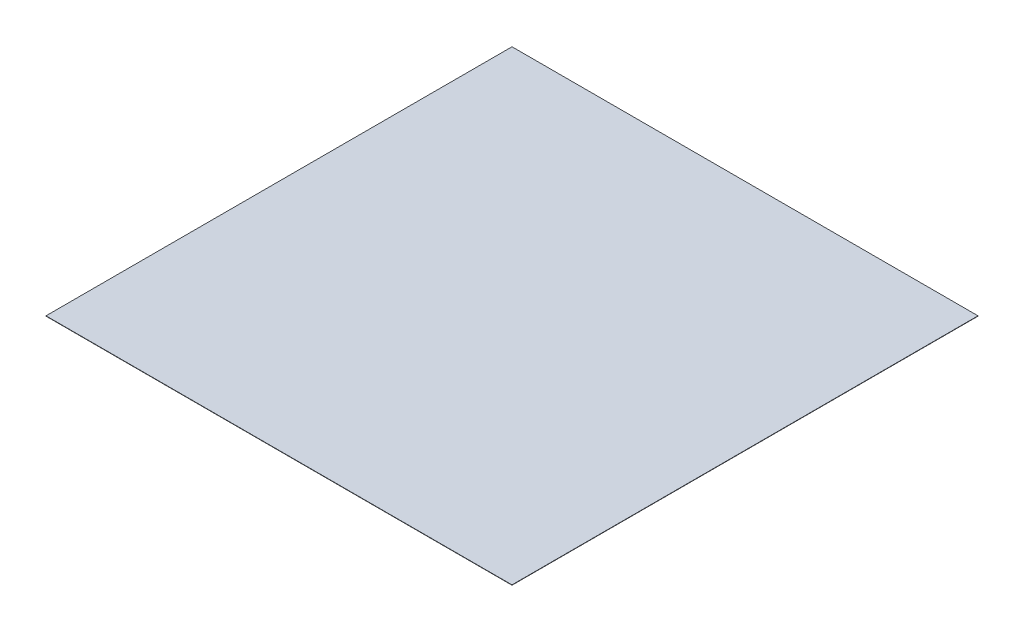
ISO-10303-21;
HEADER;
FILE_DESCRIPTION(('STEP AP214'),'2;1');
FILE_NAME('part.step','',(''),(''),'','','');
FILE_SCHEMA(('AUTOMOTIVE_DESIGN { 1 0 10303 214 1 1 1 1 }'));
ENDSEC;
DATA;
#1=APPLICATION_CONTEXT('core data for automotive mechanical design processes');
#2=APPLICATION_PROTOCOL_DEFINITION('international standard','automotive_design',2000,#1);
#3=PRODUCT_CONTEXT('',#1,'mechanical');
#4=PRODUCT('Part','Part','',(#3));
#5=PRODUCT_RELATED_PRODUCT_CATEGORY('part','',(#4));
#6=PRODUCT_DEFINITION_FORMATION('','',#4);
#7=PRODUCT_DEFINITION_CONTEXT('part definition',#1,'design');
#8=PRODUCT_DEFINITION('design','',#6,#7);
#9=PRODUCT_DEFINITION_SHAPE('','',#8);
#10=(LENGTH_UNIT() NAMED_UNIT(*) SI_UNIT(.MILLI.,.METRE.));
#11=(NAMED_UNIT(*) PLANE_ANGLE_UNIT() SI_UNIT($,.RADIAN.));
#12=(NAMED_UNIT(*) SI_UNIT($,.STERADIAN.) SOLID_ANGLE_UNIT());
#13=UNCERTAINTY_MEASURE_WITH_UNIT(LENGTH_MEASURE(1.E-05),#10,'distance_accuracy_value','');
#14=(GEOMETRIC_REPRESENTATION_CONTEXT(3) GLOBAL_UNCERTAINTY_ASSIGNED_CONTEXT((#13)) GLOBAL_UNIT_ASSIGNED_CONTEXT((#10,
#11,#12)) REPRESENTATION_CONTEXT('',''));
#15=CARTESIAN_POINT('',(0.,0.,0.));
#16=DIRECTION('',(0.,0.,1.));
#17=DIRECTION('',(1.,0.,0.));
#18=AXIS2_PLACEMENT_3D('',#15,#16,#17);
#19=CARTESIAN_POINT('',(0.,10.,0.));
#20=DIRECTION('',(1.,0.,0.));
#21=DIRECTION('',(0.,0.,-1.));
#22=AXIS2_PLACEMENT_3D('',#19,#20,#21);
#23=PLANE('',#22);
#24=DIRECTION('',(0.,0.,1.));
#25=VECTOR('',#24,1.);
#26=CARTESIAN_POINT('',(0.,0.,0.));
#27=LINE('',#26,#25);
#28=CARTESIAN_POINT('',(0.,0.,-14000.));
#29=VERTEX_POINT('',#28);
#30=CARTESIAN_POINT('',(0.,0.,0.));
#31=VERTEX_POINT('',#30);
#32=EDGE_CURVE('E96',#29,#31,#27,.T.);
#33=ORIENTED_EDGE('',*,*,#32,.T.);
#34=DIRECTION('',(0.,-1.,0.));
#35=VECTOR('',#34,1.);
#36=CARTESIAN_POINT('',(0.,10.,0.));
#37=LINE('',#36,#35);
#38=CARTESIAN_POINT('',(0.,10.,0.));
#39=VERTEX_POINT('',#38);
#40=EDGE_CURVE('E11',#39,#31,#37,.T.);
#41=ORIENTED_EDGE('',*,*,#40,.F.);
#42=DIRECTION('',(0.,0.,1.));
#43=VECTOR('',#42,1.);
#44=CARTESIAN_POINT('',(0.,10.,0.));
#45=LINE('',#44,#43);
#46=CARTESIAN_POINT('',(0.,10.,-14000.));
#47=VERTEX_POINT('',#46);
#48=EDGE_CURVE('E84',#47,#39,#45,.T.);
#49=ORIENTED_EDGE('',*,*,#48,.F.);
#50=DIRECTION('',(0.,-1.,0.));
#51=VECTOR('',#50,1.);
#52=CARTESIAN_POINT('',(0.,10.,-14000.));
#53=LINE('',#52,#51);
#54=EDGE_CURVE('E92',#47,#29,#53,.T.);
#55=ORIENTED_EDGE('',*,*,#54,.T.);
#56=EDGE_LOOP('',(#33,#41,#49,#55));
#57=FACE_BOUND('',#56,.T.);
#58=ADVANCED_FACE('F33',(#57),#23,.F.);
#59=CARTESIAN_POINT('',(0.,10.,0.));
#60=DIRECTION('',(0.,0.,-1.));
#61=DIRECTION('',(-1.,0.,0.));
#62=AXIS2_PLACEMENT_3D('',#59,#60,#61);
#63=PLANE('',#62);
#64=DIRECTION('',(1.,0.,0.));
#65=VECTOR('',#64,1.);
#66=CARTESIAN_POINT('',(0.,0.,0.));
#67=LINE('',#66,#65);
#68=CARTESIAN_POINT('',(14000.,0.,0.));
#69=VERTEX_POINT('',#68);
#70=EDGE_CURVE('E88',#31,#69,#67,.T.);
#71=ORIENTED_EDGE('',*,*,#70,.T.);
#72=DIRECTION('',(0.,-1.,0.));
#73=VECTOR('',#72,1.);
#74=CARTESIAN_POINT('',(14000.,10.,0.));
#75=LINE('',#74,#73);
#76=CARTESIAN_POINT('',(14000.,10.,0.));
#77=VERTEX_POINT('',#76);
#78=EDGE_CURVE('E41',#77,#69,#75,.T.);
#79=ORIENTED_EDGE('',*,*,#78,.F.);
#80=DIRECTION('',(1.,0.,0.));
#81=VECTOR('',#80,1.);
#82=CARTESIAN_POINT('',(0.,10.,0.));
#83=LINE('',#82,#81);
#84=EDGE_CURVE('E79',#39,#77,#83,.T.);
#85=ORIENTED_EDGE('',*,*,#84,.F.);
#86=ORIENTED_EDGE('',*,*,#40,.T.);
#87=EDGE_LOOP('',(#71,#79,#85,#86));
#88=FACE_BOUND('',#87,.T.);
#89=ADVANCED_FACE('F87',(#88),#63,.F.);
#90=CARTESIAN_POINT('',(14000.,10.,0.));
#91=DIRECTION('',(-1.,0.,0.));
#92=DIRECTION('',(0.,0.,1.));
#93=AXIS2_PLACEMENT_3D('',#90,#91,#92);
#94=PLANE('',#93);
#95=DIRECTION('',(0.,0.,-1.));
#96=VECTOR('',#95,1.);
#97=CARTESIAN_POINT('',(14000.,0.,0.));
#98=LINE('',#97,#96);
#99=CARTESIAN_POINT('',(14000.,0.,-14000.));
#100=VERTEX_POINT('',#99);
#101=EDGE_CURVE('E66',#69,#100,#98,.T.);
#102=ORIENTED_EDGE('',*,*,#101,.T.);
#103=DIRECTION('',(0.,-1.,0.));
#104=VECTOR('',#103,1.);
#105=CARTESIAN_POINT('',(14000.,10.,-14000.));
#106=LINE('',#105,#104);
#107=CARTESIAN_POINT('',(14000.,10.,-14000.));
#108=VERTEX_POINT('',#107);
#109=EDGE_CURVE('E89',#108,#100,#106,.T.);
#110=ORIENTED_EDGE('',*,*,#109,.F.);
#111=DIRECTION('',(0.,0.,-1.));
#112=VECTOR('',#111,1.);
#113=CARTESIAN_POINT('',(14000.,10.,0.));
#114=LINE('',#113,#112);
#115=EDGE_CURVE('E82',#77,#108,#114,.T.);
#116=ORIENTED_EDGE('',*,*,#115,.F.);
#117=ORIENTED_EDGE('',*,*,#78,.T.);
#118=EDGE_LOOP('',(#102,#110,#116,#117));
#119=FACE_BOUND('',#118,.T.);
#120=ADVANCED_FACE('F90',(#119),#94,.F.);
#121=CARTESIAN_POINT('',(0.,10.,-14000.));
#122=DIRECTION('',(0.,0.,1.));
#123=DIRECTION('',(1.,0.,0.));
#124=AXIS2_PLACEMENT_3D('',#121,#122,#123);
#125=PLANE('',#124);
#126=DIRECTION('',(-1.,0.,0.));
#127=VECTOR('',#126,1.);
#128=CARTESIAN_POINT('',(0.,0.,-14000.));
#129=LINE('',#128,#127);
#130=EDGE_CURVE('E72',#100,#29,#129,.T.);
#131=ORIENTED_EDGE('',*,*,#130,.T.);
#132=ORIENTED_EDGE('',*,*,#54,.F.);
#133=DIRECTION('',(-1.,0.,0.));
#134=VECTOR('',#133,1.);
#135=CARTESIAN_POINT('',(0.,10.,-14000.));
#136=LINE('',#135,#134);
#137=EDGE_CURVE('E49',#108,#47,#136,.T.);
#138=ORIENTED_EDGE('',*,*,#137,.F.);
#139=ORIENTED_EDGE('',*,*,#109,.T.);
#140=EDGE_LOOP('',(#131,#132,#138,#139));
#141=FACE_BOUND('',#140,.T.);
#142=ADVANCED_FACE('F103',(#141),#125,.F.);
#143=CARTESIAN_POINT('',(0.,10.,0.));
#144=DIRECTION('',(0.,-1.,0.));
#145=DIRECTION('',(0.,0.,-1.));
#146=AXIS2_PLACEMENT_3D('',#143,#144,#145);
#147=PLANE('',#146);
#148=ORIENTED_EDGE('',*,*,#48,.T.);
#149=ORIENTED_EDGE('',*,*,#84,.T.);
#150=ORIENTED_EDGE('',*,*,#115,.T.);
#151=ORIENTED_EDGE('',*,*,#137,.T.);
#152=EDGE_LOOP('',(#148,#149,#150,#151));
#153=FACE_BOUND('',#152,.T.);
#154=ADVANCED_FACE('F80',(#153),#147,.F.);
#155=CARTESIAN_POINT('',(0.,0.,0.));
#156=DIRECTION('',(0.,-1.,0.));
#157=DIRECTION('',(0.,0.,-1.));
#158=AXIS2_PLACEMENT_3D('',#155,#156,#157);
#159=PLANE('',#158);
#160=ORIENTED_EDGE('',*,*,#32,.F.);
#161=ORIENTED_EDGE('',*,*,#130,.F.);
#162=ORIENTED_EDGE('',*,*,#101,.F.);
#163=ORIENTED_EDGE('',*,*,#70,.F.);
#164=EDGE_LOOP('',(#160,#161,#162,#163));
#165=FACE_BOUND('',#164,.T.);
#166=ADVANCED_FACE('F106',(#165),#159,.T.);
#167=CLOSED_SHELL('',(#58,#89,#120,#142,#154,#166));
#168=MANIFOLD_SOLID_BREP('B2',#167);
#169=ADVANCED_BREP_SHAPE_REPRESENTATION('',(#18,#168),#14);
#170=SHAPE_DEFINITION_REPRESENTATION(#9,#169);
ENDSEC;
END-ISO-10303-21;
